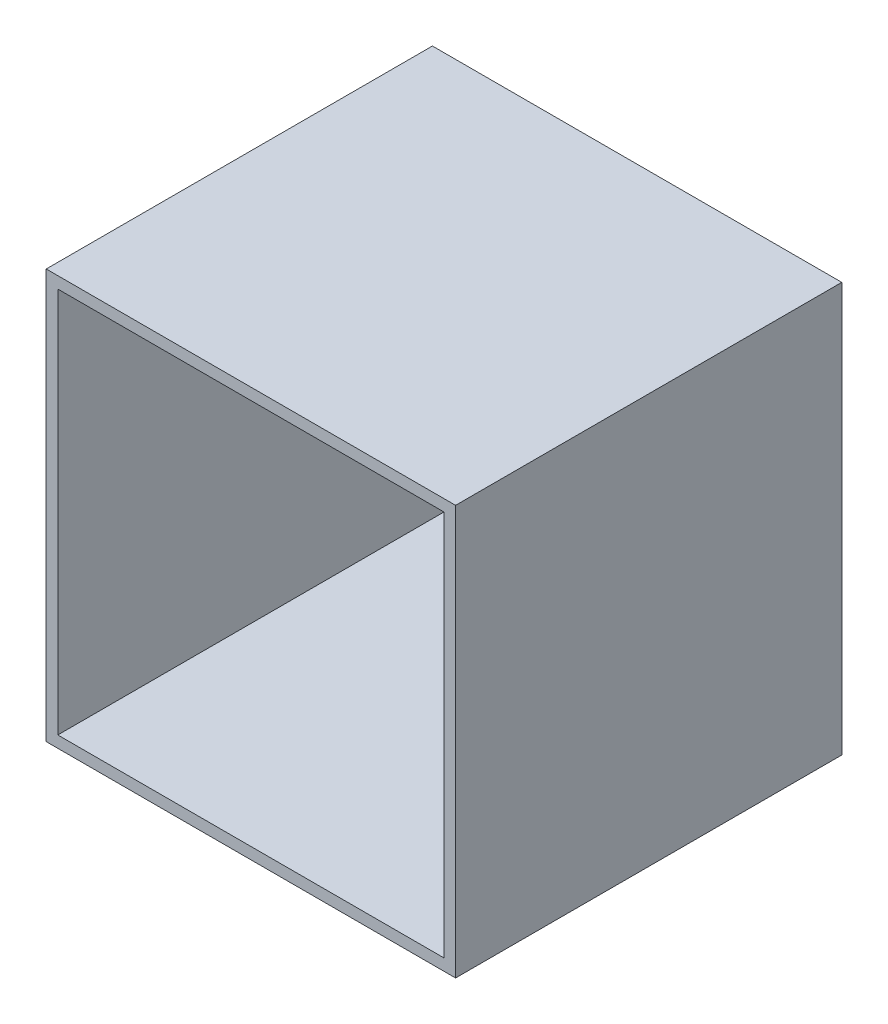
ISO-10303-21;
HEADER;
FILE_DESCRIPTION(('STEP AP214'),'2;1');
FILE_NAME('part.step','',(''),(''),'','','');
FILE_SCHEMA(('AUTOMOTIVE_DESIGN { 1 0 10303 214 1 1 1 1 }'));
ENDSEC;
DATA;
#1=APPLICATION_CONTEXT('core data for automotive mechanical design processes');
#2=APPLICATION_PROTOCOL_DEFINITION('international standard','automotive_design',2000,#1);
#3=PRODUCT_CONTEXT('',#1,'mechanical');
#4=PRODUCT('Part','Part','',(#3));
#5=PRODUCT_RELATED_PRODUCT_CATEGORY('part','',(#4));
#6=PRODUCT_DEFINITION_FORMATION('','',#4);
#7=PRODUCT_DEFINITION_CONTEXT('part definition',#1,'design');
#8=PRODUCT_DEFINITION('design','',#6,#7);
#9=PRODUCT_DEFINITION_SHAPE('','',#8);
#10=(LENGTH_UNIT() NAMED_UNIT(*) SI_UNIT(.MILLI.,.METRE.));
#11=(NAMED_UNIT(*) PLANE_ANGLE_UNIT() SI_UNIT($,.RADIAN.));
#12=(NAMED_UNIT(*) SI_UNIT($,.STERADIAN.) SOLID_ANGLE_UNIT());
#13=UNCERTAINTY_MEASURE_WITH_UNIT(LENGTH_MEASURE(1.E-05),#10,'distance_accuracy_value','');
#14=(GEOMETRIC_REPRESENTATION_CONTEXT(3) GLOBAL_UNCERTAINTY_ASSIGNED_CONTEXT((#13)) GLOBAL_UNIT_ASSIGNED_CONTEXT((#10,
#11,#12)) REPRESENTATION_CONTEXT('',''));
#15=CARTESIAN_POINT('',(0.,0.,0.));
#16=DIRECTION('',(0.,0.,1.));
#17=DIRECTION('',(1.,0.,0.));
#18=AXIS2_PLACEMENT_3D('',#15,#16,#17);
#19=CARTESIAN_POINT('',(0.,0.,100.));
#20=DIRECTION('',(0.,0.,-1.));
#21=DIRECTION('',(-1.,0.,0.));
#22=AXIS2_PLACEMENT_3D('',#19,#20,#21);
#23=PLANE('',#22);
#24=DIRECTION('',(-1.,0.,0.));
#25=VECTOR('',#24,1.);
#26=CARTESIAN_POINT('',(-6.08789852690201,-2.80251621926212,100.));
#27=LINE('',#26,#25);
#28=CARTESIAN_POINT('',(99.912101473098,-2.80251621926212,100.));
#29=VERTEX_POINT('',#28);
#30=CARTESIAN_POINT('',(-6.08789852690201,-2.80251621926212,100.));
#31=VERTEX_POINT('',#30);
#32=EDGE_CURVE('E134',#29,#31,#27,.T.);
#33=ORIENTED_EDGE('',*,*,#32,.T.);
#34=DIRECTION('',(0.,-1.,0.));
#35=VECTOR('',#34,1.);
#36=CARTESIAN_POINT('',(-6.08789852690201,-2.80251621926212,100.));
#37=LINE('',#36,#35);
#38=CARTESIAN_POINT('',(-6.08789852690201,-108.802516219262,100.));
#39=VERTEX_POINT('',#38);
#40=EDGE_CURVE('E137',#31,#39,#37,.T.);
#41=ORIENTED_EDGE('',*,*,#40,.T.);
#42=DIRECTION('',(1.,0.,0.));
#43=VECTOR('',#42,1.);
#44=CARTESIAN_POINT('',(-6.08789852690201,-108.802516219262,100.));
#45=LINE('',#44,#43);
#46=CARTESIAN_POINT('',(99.912101473098,-108.802516219262,100.));
#47=VERTEX_POINT('',#46);
#48=EDGE_CURVE('E140',#39,#47,#45,.T.);
#49=ORIENTED_EDGE('',*,*,#48,.T.);
#50=DIRECTION('',(0.,1.,0.));
#51=VECTOR('',#50,1.);
#52=CARTESIAN_POINT('',(99.912101473098,-2.80251621926212,100.));
#53=LINE('',#52,#51);
#54=EDGE_CURVE('E142',#47,#29,#53,.T.);
#55=ORIENTED_EDGE('',*,*,#54,.T.);
#56=EDGE_LOOP('',(#33,#41,#49,#55));
#57=FACE_BOUND('',#56,.T.);
#58=DIRECTION('',(-1.,0.,0.));
#59=VECTOR('',#58,1.);
#60=CARTESIAN_POINT('',(-3.08789852690201,-5.80251621926212,100.));
#61=LINE('',#60,#59);
#62=CARTESIAN_POINT('',(96.912101473098,-5.8025162192621,100.));
#63=VERTEX_POINT('',#62);
#64=CARTESIAN_POINT('',(-3.08789852690201,-5.80251621926212,100.));
#65=VERTEX_POINT('',#64);
#66=EDGE_CURVE('E98',#63,#65,#61,.T.);
#67=ORIENTED_EDGE('',*,*,#66,.F.);
#68=DIRECTION('',(0.,1.,0.));
#69=VECTOR('',#68,1.);
#70=CARTESIAN_POINT('',(96.912101473098,-5.8025162192621,100.));
#71=LINE('',#70,#69);
#72=CARTESIAN_POINT('',(96.912101473098,-105.802516219262,100.));
#73=VERTEX_POINT('',#72);
#74=EDGE_CURVE('E120',#73,#63,#71,.T.);
#75=ORIENTED_EDGE('',*,*,#74,.F.);
#76=DIRECTION('',(1.,0.,0.));
#77=VECTOR('',#76,1.);
#78=CARTESIAN_POINT('',(-3.08789852690202,-105.802516219262,100.));
#79=LINE('',#78,#77);
#80=CARTESIAN_POINT('',(-3.08789852690202,-105.802516219262,100.));
#81=VERTEX_POINT('',#80);
#82=EDGE_CURVE('E118',#81,#73,#79,.T.);
#83=ORIENTED_EDGE('',*,*,#82,.F.);
#84=DIRECTION('',(0.,-1.,0.));
#85=VECTOR('',#84,1.);
#86=CARTESIAN_POINT('',(-3.08789852690201,-5.80251621926212,100.));
#87=LINE('',#86,#85);
#88=EDGE_CURVE('E106',#65,#81,#87,.T.);
#89=ORIENTED_EDGE('',*,*,#88,.F.);
#90=EDGE_LOOP('',(#67,#75,#83,#89));
#91=FACE_BOUND('',#90,.T.);
#92=ADVANCED_FACE('F33',(#57,#91),#23,.F.);
#93=CARTESIAN_POINT('',(0.,0.,0.));
#94=DIRECTION('',(0.,0.,-1.));
#95=DIRECTION('',(-1.,0.,0.));
#96=AXIS2_PLACEMENT_3D('',#93,#94,#95);
#97=PLANE('',#96);
#98=DIRECTION('',(-1.,0.,0.));
#99=VECTOR('',#98,1.);
#100=CARTESIAN_POINT('',(-6.08789852690201,-2.80251621926212,0.));
#101=LINE('',#100,#99);
#102=CARTESIAN_POINT('',(99.912101473098,-2.80251621926212,0.));
#103=VERTEX_POINT('',#102);
#104=CARTESIAN_POINT('',(-6.08789852690201,-2.80251621926212,0.));
#105=VERTEX_POINT('',#104);
#106=EDGE_CURVE('E114',#103,#105,#101,.T.);
#107=ORIENTED_EDGE('',*,*,#106,.F.);
#108=DIRECTION('',(0.,1.,0.));
#109=VECTOR('',#108,1.);
#110=CARTESIAN_POINT('',(99.912101473098,-2.80251621926212,0.));
#111=LINE('',#110,#109);
#112=CARTESIAN_POINT('',(99.912101473098,-108.802516219262,0.));
#113=VERTEX_POINT('',#112);
#114=EDGE_CURVE('E138',#113,#103,#111,.T.);
#115=ORIENTED_EDGE('',*,*,#114,.F.);
#116=DIRECTION('',(1.,0.,0.));
#117=VECTOR('',#116,1.);
#118=CARTESIAN_POINT('',(-6.08789852690201,-108.802516219262,0.));
#119=LINE('',#118,#117);
#120=CARTESIAN_POINT('',(-6.08789852690201,-108.802516219262,0.));
#121=VERTEX_POINT('',#120);
#122=EDGE_CURVE('E149',#121,#113,#119,.T.);
#123=ORIENTED_EDGE('',*,*,#122,.F.);
#124=DIRECTION('',(0.,-1.,0.));
#125=VECTOR('',#124,1.);
#126=CARTESIAN_POINT('',(-6.08789852690201,-2.80251621926212,0.));
#127=LINE('',#126,#125);
#128=EDGE_CURVE('E147',#105,#121,#127,.T.);
#129=ORIENTED_EDGE('',*,*,#128,.F.);
#130=EDGE_LOOP('',(#107,#115,#123,#129));
#131=FACE_BOUND('',#130,.T.);
#132=DIRECTION('',(0.,1.,0.));
#133=VECTOR('',#132,1.);
#134=CARTESIAN_POINT('',(96.912101473098,-5.8025162192621,0.));
#135=LINE('',#134,#133);
#136=CARTESIAN_POINT('',(96.912101473098,-105.802516219262,0.));
#137=VERTEX_POINT('',#136);
#138=CARTESIAN_POINT('',(96.912101473098,-5.8025162192621,0.));
#139=VERTEX_POINT('',#138);
#140=EDGE_CURVE('E107',#137,#139,#135,.T.);
#141=ORIENTED_EDGE('',*,*,#140,.T.);
#142=DIRECTION('',(-1.,0.,0.));
#143=VECTOR('',#142,1.);
#144=CARTESIAN_POINT('',(-3.08789852690201,-5.80251621926212,0.));
#145=LINE('',#144,#143);
#146=CARTESIAN_POINT('',(-3.08789852690201,-5.80251621926212,0.));
#147=VERTEX_POINT('',#146);
#148=EDGE_CURVE('E56',#139,#147,#145,.T.);
#149=ORIENTED_EDGE('',*,*,#148,.T.);
#150=DIRECTION('',(0.,-1.,0.));
#151=VECTOR('',#150,1.);
#152=CARTESIAN_POINT('',(-3.08789852690201,-5.80251621926212,0.));
#153=LINE('',#152,#151);
#154=CARTESIAN_POINT('',(-3.08789852690202,-105.802516219262,0.));
#155=VERTEX_POINT('',#154);
#156=EDGE_CURVE('E113',#147,#155,#153,.T.);
#157=ORIENTED_EDGE('',*,*,#156,.T.);
#158=DIRECTION('',(1.,0.,0.));
#159=VECTOR('',#158,1.);
#160=CARTESIAN_POINT('',(-3.08789852690202,-105.802516219262,0.));
#161=LINE('',#160,#159);
#162=EDGE_CURVE('E126',#155,#137,#161,.T.);
#163=ORIENTED_EDGE('',*,*,#162,.T.);
#164=EDGE_LOOP('',(#141,#149,#157,#163));
#165=FACE_BOUND('',#164,.T.);
#166=ADVANCED_FACE('F167',(#131,#165),#97,.T.);
#167=CARTESIAN_POINT('',(-6.08789852690201,-2.80251621926212,100.));
#168=DIRECTION('',(0.,-1.,0.));
#169=DIRECTION('',(0.,0.,-1.));
#170=AXIS2_PLACEMENT_3D('',#167,#168,#169);
#171=PLANE('',#170);
#172=ORIENTED_EDGE('',*,*,#106,.T.);
#173=DIRECTION('',(0.,0.,-1.));
#174=VECTOR('',#173,1.);
#175=CARTESIAN_POINT('',(-6.08789852690201,-2.80251621926212,100.));
#176=LINE('',#175,#174);
#177=EDGE_CURVE('E11',#31,#105,#176,.T.);
#178=ORIENTED_EDGE('',*,*,#177,.F.);
#179=ORIENTED_EDGE('',*,*,#32,.F.);
#180=DIRECTION('',(0.,0.,-1.));
#181=VECTOR('',#180,1.);
#182=CARTESIAN_POINT('',(99.912101473098,-2.80251621926212,100.));
#183=LINE('',#182,#181);
#184=EDGE_CURVE('E144',#29,#103,#183,.T.);
#185=ORIENTED_EDGE('',*,*,#184,.T.);
#186=EDGE_LOOP('',(#172,#178,#179,#185));
#187=FACE_BOUND('',#186,.T.);
#188=ADVANCED_FACE('F35',(#187),#171,.F.);
#189=CARTESIAN_POINT('',(-6.08789852690201,-2.80251621926212,100.));
#190=DIRECTION('',(1.,0.,0.));
#191=DIRECTION('',(0.,0.,-1.));
#192=AXIS2_PLACEMENT_3D('',#189,#190,#191);
#193=PLANE('',#192);
#194=ORIENTED_EDGE('',*,*,#128,.T.);
#195=DIRECTION('',(0.,0.,-1.));
#196=VECTOR('',#195,1.);
#197=CARTESIAN_POINT('',(-6.08789852690201,-108.802516219262,100.));
#198=LINE('',#197,#196);
#199=EDGE_CURVE('E41',#39,#121,#198,.T.);
#200=ORIENTED_EDGE('',*,*,#199,.F.);
#201=ORIENTED_EDGE('',*,*,#40,.F.);
#202=ORIENTED_EDGE('',*,*,#177,.T.);
#203=EDGE_LOOP('',(#194,#200,#201,#202));
#204=FACE_BOUND('',#203,.T.);
#205=ADVANCED_FACE('F177',(#204),#193,.F.);
#206=CARTESIAN_POINT('',(-6.08789852690201,-108.802516219262,100.));
#207=DIRECTION('',(0.,1.,0.));
#208=DIRECTION('',(0.,0.,1.));
#209=AXIS2_PLACEMENT_3D('',#206,#207,#208);
#210=PLANE('',#209);
#211=ORIENTED_EDGE('',*,*,#122,.T.);
#212=DIRECTION('',(0.,0.,-1.));
#213=VECTOR('',#212,1.);
#214=CARTESIAN_POINT('',(99.912101473098,-108.802516219262,100.));
#215=LINE('',#214,#213);
#216=EDGE_CURVE('E154',#47,#113,#215,.T.);
#217=ORIENTED_EDGE('',*,*,#216,.F.);
#218=ORIENTED_EDGE('',*,*,#48,.F.);
#219=ORIENTED_EDGE('',*,*,#199,.T.);
#220=EDGE_LOOP('',(#211,#217,#218,#219));
#221=FACE_BOUND('',#220,.T.);
#222=ADVANCED_FACE('F161',(#221),#210,.F.);
#223=CARTESIAN_POINT('',(99.912101473098,-2.80251621926212,100.));
#224=DIRECTION('',(-1.,0.,0.));
#225=DIRECTION('',(0.,0.,1.));
#226=AXIS2_PLACEMENT_3D('',#223,#224,#225);
#227=PLANE('',#226);
#228=ORIENTED_EDGE('',*,*,#114,.T.);
#229=ORIENTED_EDGE('',*,*,#184,.F.);
#230=ORIENTED_EDGE('',*,*,#54,.F.);
#231=ORIENTED_EDGE('',*,*,#216,.T.);
#232=EDGE_LOOP('',(#228,#229,#230,#231));
#233=FACE_BOUND('',#232,.T.);
#234=ADVANCED_FACE('F171',(#233),#227,.F.);
#235=CARTESIAN_POINT('',(-3.08789852690201,-5.80251621926212,100.));
#236=DIRECTION('',(0.,-1.,0.));
#237=DIRECTION('',(1.,0.,0.));
#238=AXIS2_PLACEMENT_3D('',#235,#236,#237);
#239=PLANE('',#238);
#240=ORIENTED_EDGE('',*,*,#148,.F.);
#241=DIRECTION('',(0.,0.,-1.));
#242=VECTOR('',#241,1.);
#243=CARTESIAN_POINT('',(96.912101473098,-5.8025162192621,100.));
#244=LINE('',#243,#242);
#245=EDGE_CURVE('E102',#63,#139,#244,.T.);
#246=ORIENTED_EDGE('',*,*,#245,.F.);
#247=ORIENTED_EDGE('',*,*,#66,.T.);
#248=DIRECTION('',(0.,0.,-1.));
#249=VECTOR('',#248,1.);
#250=CARTESIAN_POINT('',(-3.08789852690201,-5.80251621926212,100.));
#251=LINE('',#250,#249);
#252=EDGE_CURVE('E101',#65,#147,#251,.T.);
#253=ORIENTED_EDGE('',*,*,#252,.T.);
#254=EDGE_LOOP('',(#240,#246,#247,#253));
#255=FACE_BOUND('',#254,.T.);
#256=ADVANCED_FACE('F100',(#255),#239,.T.);
#257=CARTESIAN_POINT('',(-3.08789852690201,-5.80251621926212,100.));
#258=DIRECTION('',(1.,0.,0.));
#259=DIRECTION('',(0.,1.,0.));
#260=AXIS2_PLACEMENT_3D('',#257,#258,#259);
#261=PLANE('',#260);
#262=ORIENTED_EDGE('',*,*,#156,.F.);
#263=ORIENTED_EDGE('',*,*,#252,.F.);
#264=ORIENTED_EDGE('',*,*,#88,.T.);
#265=DIRECTION('',(0.,0.,-1.));
#266=VECTOR('',#265,1.);
#267=CARTESIAN_POINT('',(-3.08789852690202,-105.802516219262,100.));
#268=LINE('',#267,#266);
#269=EDGE_CURVE('E115',#81,#155,#268,.T.);
#270=ORIENTED_EDGE('',*,*,#269,.T.);
#271=EDGE_LOOP('',(#262,#263,#264,#270));
#272=FACE_BOUND('',#271,.T.);
#273=ADVANCED_FACE('F110',(#272),#261,.T.);
#274=CARTESIAN_POINT('',(-3.08789852690202,-105.802516219262,100.));
#275=DIRECTION('',(0.,1.,0.));
#276=DIRECTION('',(-1.,0.,0.));
#277=AXIS2_PLACEMENT_3D('',#274,#275,#276);
#278=PLANE('',#277);
#279=ORIENTED_EDGE('',*,*,#162,.F.);
#280=ORIENTED_EDGE('',*,*,#269,.F.);
#281=ORIENTED_EDGE('',*,*,#82,.T.);
#282=DIRECTION('',(0.,0.,-1.));
#283=VECTOR('',#282,1.);
#284=CARTESIAN_POINT('',(96.912101473098,-105.802516219262,100.));
#285=LINE('',#284,#283);
#286=EDGE_CURVE('E48',#73,#137,#285,.T.);
#287=ORIENTED_EDGE('',*,*,#286,.T.);
#288=EDGE_LOOP('',(#279,#280,#281,#287));
#289=FACE_BOUND('',#288,.T.);
#290=ADVANCED_FACE('F200',(#289),#278,.T.);
#291=CARTESIAN_POINT('',(96.912101473098,-5.8025162192621,100.));
#292=DIRECTION('',(-1.,0.,0.));
#293=DIRECTION('',(0.,-1.,0.));
#294=AXIS2_PLACEMENT_3D('',#291,#292,#293);
#295=PLANE('',#294);
#296=ORIENTED_EDGE('',*,*,#140,.F.);
#297=ORIENTED_EDGE('',*,*,#286,.F.);
#298=ORIENTED_EDGE('',*,*,#74,.T.);
#299=ORIENTED_EDGE('',*,*,#245,.T.);
#300=EDGE_LOOP('',(#296,#297,#298,#299));
#301=FACE_BOUND('',#300,.T.);
#302=ADVANCED_FACE('F204',(#301),#295,.T.);
#303=CLOSED_SHELL('',(#92,#166,#188,#205,#222,#234,#256,#273,#290,#302));
#304=MANIFOLD_SOLID_BREP('B2',#303);
#305=ADVANCED_BREP_SHAPE_REPRESENTATION('',(#18,#304),#14);
#306=SHAPE_DEFINITION_REPRESENTATION(#9,#305);
ENDSEC;
END-ISO-10303-21;
